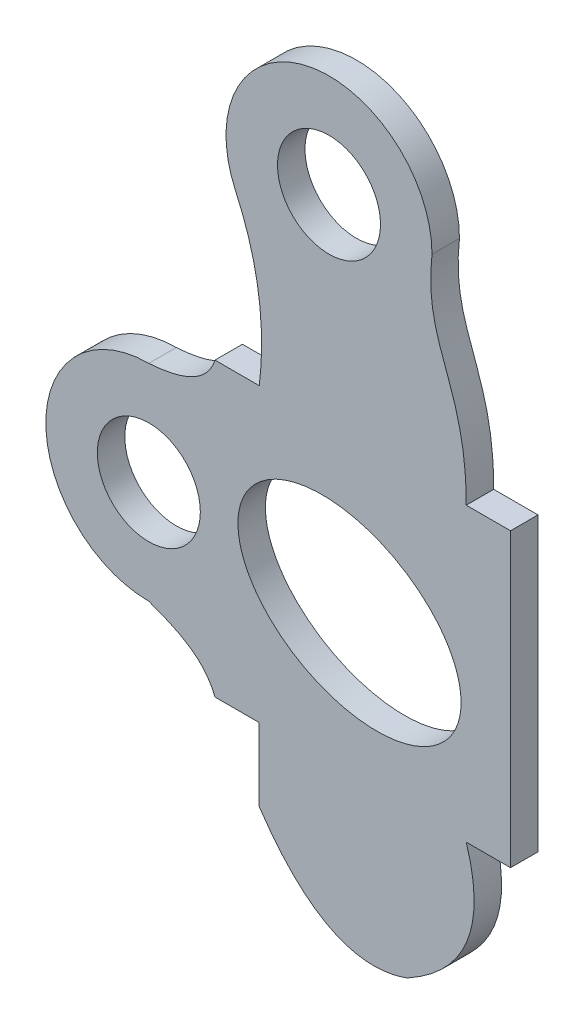
ISO-10303-21;
HEADER;
FILE_DESCRIPTION(('STEP AP214'),'2;1');
FILE_NAME('part.step','',(''),(''),'','','');
FILE_SCHEMA(('AUTOMOTIVE_DESIGN { 1 0 10303 214 1 1 1 1 }'));
ENDSEC;
DATA;
#1=APPLICATION_CONTEXT('core data for automotive mechanical design processes');
#2=APPLICATION_PROTOCOL_DEFINITION('international standard','automotive_design',2000,#1);
#3=PRODUCT_CONTEXT('',#1,'mechanical');
#4=PRODUCT('Part','Part','',(#3));
#5=PRODUCT_RELATED_PRODUCT_CATEGORY('part','',(#4));
#6=PRODUCT_DEFINITION_FORMATION('','',#4);
#7=PRODUCT_DEFINITION_CONTEXT('part definition',#1,'design');
#8=PRODUCT_DEFINITION('design','',#6,#7);
#9=PRODUCT_DEFINITION_SHAPE('','',#8);
#10=(LENGTH_UNIT() NAMED_UNIT(*) SI_UNIT(.MILLI.,.METRE.));
#11=(NAMED_UNIT(*) PLANE_ANGLE_UNIT() SI_UNIT($,.RADIAN.));
#12=(NAMED_UNIT(*) SI_UNIT($,.STERADIAN.) SOLID_ANGLE_UNIT());
#13=UNCERTAINTY_MEASURE_WITH_UNIT(LENGTH_MEASURE(1.E-05),#10,'distance_accuracy_value','');
#14=(GEOMETRIC_REPRESENTATION_CONTEXT(3) GLOBAL_UNCERTAINTY_ASSIGNED_CONTEXT((#13)) GLOBAL_UNIT_ASSIGNED_CONTEXT((#10,
#11,#12)) REPRESENTATION_CONTEXT('',''));
#15=CARTESIAN_POINT('',(0.,0.,0.));
#16=DIRECTION('',(0.,0.,1.));
#17=DIRECTION('',(1.,0.,0.));
#18=AXIS2_PLACEMENT_3D('',#15,#16,#17);
#19=CARTESIAN_POINT('',(6.,0.,1.6));
#20=CARTESIAN_POINT('',(5.45390542392349,-4.8146678348564,1.6));
#21=CARTESIAN_POINT('',(8.01032004438015,-5.6020208774235,1.6));
#22=CARTESIAN_POINT('',(7.9955341775791,-11.6645240386324,1.6));
#23=B_SPLINE_CURVE_WITH_KNOTS('',3,(#19,#20,#21,#22),.UNSPECIFIED.,.F.,.F.,(4,4),(0.,1.),.UNSPECIFIED.);
#24=DIRECTION('',(0.,0.,-1.));
#25=VECTOR('',#24,1.);
#26=SURFACE_OF_LINEAR_EXTRUSION('',#23,#25);
#27=CARTESIAN_POINT('',(6.,0.,0.));
#28=CARTESIAN_POINT('',(5.45390542392349,-4.8146678348564,0.));
#29=CARTESIAN_POINT('',(8.01032004438015,-5.6020208774235,0.));
#30=CARTESIAN_POINT('',(7.9955341775791,-11.6645240386324,0.));
#31=B_SPLINE_CURVE_WITH_KNOTS('',3,(#27,#28,#29,#30),.UNSPECIFIED.,.F.,.F.,(4,4),(0.,1.),.UNSPECIFIED.);
#32=CARTESIAN_POINT('',(5.99999999999995,0.,0.));
#33=VERTEX_POINT('',#32);
#34=CARTESIAN_POINT('',(7.9955341775791,-11.6645240386324,0.));
#35=VERTEX_POINT('',#34);
#36=EDGE_CURVE('E178',#33,#35,#31,.T.);
#37=ORIENTED_EDGE('',*,*,#36,.F.);
#38=DIRECTION('',(0.,0.,-1.));
#39=VECTOR('',#38,1.);
#40=CARTESIAN_POINT('',(5.99999999999995,0.,1.6));
#41=LINE('',#40,#39);
#42=CARTESIAN_POINT('',(5.99999999999995,0.,1.6));
#43=VERTEX_POINT('',#42);
#44=EDGE_CURVE('E11',#43,#33,#41,.T.);
#45=ORIENTED_EDGE('',*,*,#44,.F.);
#46=CARTESIAN_POINT('',(7.9955341775791,-11.6645240386324,1.6));
#47=VERTEX_POINT('',#46);
#48=EDGE_CURVE('E360',#43,#47,#23,.T.);
#49=ORIENTED_EDGE('',*,*,#48,.T.);
#50=DIRECTION('',(0.,0.,-1.));
#51=VECTOR('',#50,1.);
#52=CARTESIAN_POINT('',(7.9955341775791,-11.6645240386324,1.6));
#53=LINE('',#52,#51);
#54=EDGE_CURVE('E54',#47,#35,#53,.T.);
#55=ORIENTED_EDGE('',*,*,#54,.T.);
#56=EDGE_LOOP('',(#37,#45,#49,#55));
#57=FACE_BOUND('',#56,.T.);
#58=ADVANCED_FACE('F37',(#57),#26,.T.);
#59=CARTESIAN_POINT('',(0.,0.,1.6));
#60=DIRECTION('',(0.,0.,-1.));
#61=DIRECTION('',(-1.,0.,0.));
#62=AXIS2_PLACEMENT_3D('',#59,#60,#61);
#63=CYLINDRICAL_SURFACE('',#62,5.99999999999995);
#64=CARTESIAN_POINT('',(0.,0.,0.));
#65=DIRECTION('',(0.,0.,1.));
#66=DIRECTION('',(1.,0.,0.));
#67=AXIS2_PLACEMENT_3D('',#64,#65,#66);
#68=CIRCLE('',#67,5.99999999999995);
#69=CARTESIAN_POINT('',(-5.46891503399917,-2.46798872584485,0.));
#70=VERTEX_POINT('',#69);
#71=EDGE_CURVE('E288',#33,#70,#68,.T.);
#72=ORIENTED_EDGE('',*,*,#71,.T.);
#73=DIRECTION('',(0.,0.,-1.));
#74=VECTOR('',#73,1.);
#75=CARTESIAN_POINT('',(-5.46891503399917,-2.46798872584485,1.6));
#76=LINE('',#75,#74);
#77=CARTESIAN_POINT('',(-5.46891503399917,-2.46798872584485,1.6));
#78=VERTEX_POINT('',#77);
#79=EDGE_CURVE('E46',#78,#70,#76,.T.);
#80=ORIENTED_EDGE('',*,*,#79,.F.);
#81=CARTESIAN_POINT('',(0.,0.,1.6));
#82=DIRECTION('',(0.,0.,1.));
#83=DIRECTION('',(1.,0.,0.));
#84=AXIS2_PLACEMENT_3D('',#81,#82,#83);
#85=CIRCLE('',#84,5.99999999999995);
#86=EDGE_CURVE('E273',#43,#78,#85,.T.);
#87=ORIENTED_EDGE('',*,*,#86,.F.);
#88=ORIENTED_EDGE('',*,*,#44,.T.);
#89=EDGE_LOOP('',(#72,#80,#87,#88));
#90=FACE_BOUND('',#89,.T.);
#91=ADVANCED_FACE('F279',(#90),#63,.T.);
#92=CARTESIAN_POINT('',(-5.46891503399921,-2.46798872584487,1.6));
#93=CARTESIAN_POINT('',(-3.46503446090008,-6.80134887140103,1.6));
#94=CARTESIAN_POINT('',(-4.0644658224209,-11.6645240386324,1.6));
#95=B_SPLINE_CURVE_WITH_KNOTS('',2,(#92,#93,#94),.UNSPECIFIED.,.F.,.F.,(3,3),(0.,1.),.UNSPECIFIED.);
#96=DIRECTION('',(0.,0.,-1.));
#97=VECTOR('',#96,1.);
#98=SURFACE_OF_LINEAR_EXTRUSION('',#95,#97);
#99=CARTESIAN_POINT('',(-5.46891503399921,-2.46798872584487,0.));
#100=CARTESIAN_POINT('',(-3.46503446090008,-6.80134887140103,0.));
#101=CARTESIAN_POINT('',(-4.0644658224209,-11.6645240386324,0.));
#102=B_SPLINE_CURVE_WITH_KNOTS('',2,(#99,#100,#101),.UNSPECIFIED.,.F.,.F.,(3,3),(0.,1.),.UNSPECIFIED.);
#103=CARTESIAN_POINT('',(-4.0644658224209,-11.6645240386324,0.));
#104=VERTEX_POINT('',#103);
#105=EDGE_CURVE('E293',#70,#104,#102,.T.);
#106=ORIENTED_EDGE('',*,*,#105,.T.);
#107=DIRECTION('',(0.,0.,-1.));
#108=VECTOR('',#107,1.);
#109=CARTESIAN_POINT('',(-4.0644658224209,-11.6645240386324,1.6));
#110=LINE('',#109,#108);
#111=CARTESIAN_POINT('',(-4.0644658224209,-11.6645240386324,1.6));
#112=VERTEX_POINT('',#111);
#113=EDGE_CURVE('E297',#112,#104,#110,.T.);
#114=ORIENTED_EDGE('',*,*,#113,.F.);
#115=EDGE_CURVE('E268',#78,#112,#95,.T.);
#116=ORIENTED_EDGE('',*,*,#115,.F.);
#117=ORIENTED_EDGE('',*,*,#79,.T.);
#118=EDGE_LOOP('',(#106,#114,#116,#117));
#119=FACE_BOUND('',#118,.T.);
#120=ADVANCED_FACE('F277',(#119),#98,.F.);
#121=CARTESIAN_POINT('',(0.,-11.6645240386324,1.6));
#122=DIRECTION('',(0.,1.,0.));
#123=DIRECTION('',(0.,0.,1.));
#124=AXIS2_PLACEMENT_3D('',#121,#122,#123);
#125=PLANE('',#124);
#126=DIRECTION('',(1.,0.,0.));
#127=VECTOR('',#126,1.);
#128=CARTESIAN_POINT('',(0.,-11.6645240386324,0.));
#129=LINE('',#128,#127);
#130=CARTESIAN_POINT('',(-6.6444658224209,-11.6645240386324,0.));
#131=VERTEX_POINT('',#130);
#132=EDGE_CURVE('E301',#131,#104,#129,.T.);
#133=ORIENTED_EDGE('',*,*,#132,.F.);
#134=DIRECTION('',(0.,0.,-1.));
#135=VECTOR('',#134,1.);
#136=CARTESIAN_POINT('',(-6.6444658224209,-11.6645240386324,1.6));
#137=LINE('',#136,#135);
#138=CARTESIAN_POINT('',(-6.6444658224209,-11.6645240386324,1.6));
#139=VERTEX_POINT('',#138);
#140=EDGE_CURVE('E382',#139,#131,#137,.T.);
#141=ORIENTED_EDGE('',*,*,#140,.F.);
#142=DIRECTION('',(1.,0.,0.));
#143=VECTOR('',#142,1.);
#144=CARTESIAN_POINT('',(0.,-11.6645240386324,1.6));
#145=LINE('',#144,#143);
#146=EDGE_CURVE('E262',#139,#112,#145,.T.);
#147=ORIENTED_EDGE('',*,*,#146,.T.);
#148=ORIENTED_EDGE('',*,*,#113,.T.);
#149=EDGE_LOOP('',(#133,#141,#147,#148));
#150=FACE_BOUND('',#149,.T.);
#151=ADVANCED_FACE('F254',(#150),#125,.T.);
#152=CARTESIAN_POINT('',(-6.6444658224209,-11.6645240386324,1.6));
#153=CARTESIAN_POINT('',(-7.21761986573423,-13.544357503307,1.6));
#154=CARTESIAN_POINT('',(-10.4964106491428,-13.7566083023555,1.6));
#155=B_SPLINE_CURVE_WITH_KNOTS('',2,(#152,#153,#154),.UNSPECIFIED.,.F.,.F.,(3,3),(0.,1.),.UNSPECIFIED.);
#156=DIRECTION('',(0.,0.,-1.));
#157=VECTOR('',#156,1.);
#158=SURFACE_OF_LINEAR_EXTRUSION('',#155,#157);
#159=CARTESIAN_POINT('',(-6.6444658224209,-11.6645240386324,0.));
#160=CARTESIAN_POINT('',(-7.21761986573423,-13.544357503307,0.));
#161=CARTESIAN_POINT('',(-10.4964106491428,-13.7566083023555,0.));
#162=B_SPLINE_CURVE_WITH_KNOTS('',2,(#159,#160,#161),.UNSPECIFIED.,.F.,.F.,(3,3),(0.,1.),.UNSPECIFIED.);
#163=CARTESIAN_POINT('',(-10.4964106491428,-13.7566083023555,0.));
#164=VERTEX_POINT('',#163);
#165=EDGE_CURVE('E303',#131,#164,#162,.T.);
#166=ORIENTED_EDGE('',*,*,#165,.T.);
#167=DIRECTION('',(0.,0.,-1.));
#168=VECTOR('',#167,1.);
#169=CARTESIAN_POINT('',(-10.4964106491428,-13.7566083023555,1.6));
#170=LINE('',#169,#168);
#171=CARTESIAN_POINT('',(-10.4964106491428,-13.7566083023555,1.6));
#172=VERTEX_POINT('',#171);
#173=EDGE_CURVE('E379',#172,#164,#170,.T.);
#174=ORIENTED_EDGE('',*,*,#173,.F.);
#175=EDGE_CURVE('E257',#139,#172,#155,.T.);
#176=ORIENTED_EDGE('',*,*,#175,.F.);
#177=ORIENTED_EDGE('',*,*,#140,.T.);
#178=EDGE_LOOP('',(#166,#174,#176,#177));
#179=FACE_BOUND('',#178,.T.);
#180=ADVANCED_FACE('F250',(#179),#158,.F.);
#181=CARTESIAN_POINT('',(-10.4964106491428,-19.7566083023555,1.6));
#182=DIRECTION('',(0.,0.,-1.));
#183=DIRECTION('',(-1.,0.,0.));
#184=AXIS2_PLACEMENT_3D('',#181,#182,#183);
#185=CYLINDRICAL_SURFACE('',#184,6.);
#186=CARTESIAN_POINT('',(-10.4964106491428,-19.7566083023555,0.));
#187=DIRECTION('',(0.,0.,1.));
#188=DIRECTION('',(1.,0.,0.));
#189=AXIS2_PLACEMENT_3D('',#186,#187,#188);
#190=CIRCLE('',#189,6.);
#191=CARTESIAN_POINT('',(-10.4964106491428,-25.7566083023555,0.));
#192=VERTEX_POINT('',#191);
#193=EDGE_CURVE('E314',#164,#192,#190,.T.);
#194=ORIENTED_EDGE('',*,*,#193,.T.);
#195=DIRECTION('',(0.,0.,-1.));
#196=VECTOR('',#195,1.);
#197=CARTESIAN_POINT('',(-10.4964106491428,-25.7566083023555,1.6));
#198=LINE('',#197,#196);
#199=CARTESIAN_POINT('',(-10.4964106491428,-25.7566083023555,1.6));
#200=VERTEX_POINT('',#199);
#201=EDGE_CURVE('E376',#200,#192,#198,.T.);
#202=ORIENTED_EDGE('',*,*,#201,.F.);
#203=CARTESIAN_POINT('',(-10.4964106491428,-19.7566083023555,1.6));
#204=DIRECTION('',(0.,0.,1.));
#205=DIRECTION('',(1.,0.,0.));
#206=AXIS2_PLACEMENT_3D('',#203,#204,#205);
#207=CIRCLE('',#206,6.);
#208=EDGE_CURVE('E235',#172,#200,#207,.T.);
#209=ORIENTED_EDGE('',*,*,#208,.F.);
#210=ORIENTED_EDGE('',*,*,#173,.T.);
#211=EDGE_LOOP('',(#194,#202,#209,#210));
#212=FACE_BOUND('',#211,.T.);
#213=ADVANCED_FACE('F246',(#212),#185,.T.);
#214=CARTESIAN_POINT('',(-10.4964106491428,-25.7566083023555,1.6));
#215=CARTESIAN_POINT('',(-8.76971482484553,-26.3939791661416,1.6));
#216=CARTESIAN_POINT('',(-7.26892822895749,-27.0535783594169,1.6));
#217=CARTESIAN_POINT('',(-6.6444658224209,-28.6645240386324,1.6));
#218=B_SPLINE_CURVE_WITH_KNOTS('',3,(#214,#215,#216,#217),.UNSPECIFIED.,.F.,.F.,(4,4),(0.,1.),.UNSPECIFIED.);
#219=DIRECTION('',(0.,0.,-1.));
#220=VECTOR('',#219,1.);
#221=SURFACE_OF_LINEAR_EXTRUSION('',#218,#220);
#222=CARTESIAN_POINT('',(-10.4964106491428,-25.7566083023555,0.));
#223=CARTESIAN_POINT('',(-8.76971482484553,-26.3939791661416,0.));
#224=CARTESIAN_POINT('',(-7.26892822895749,-27.0535783594169,0.));
#225=CARTESIAN_POINT('',(-6.6444658224209,-28.6645240386324,0.));
#226=B_SPLINE_CURVE_WITH_KNOTS('',3,(#222,#223,#224,#225),.UNSPECIFIED.,.F.,.F.,(4,4),(0.,1.),.UNSPECIFIED.);
#227=CARTESIAN_POINT('',(-6.6444658224209,-28.6645240386324,0.));
#228=VERTEX_POINT('',#227);
#229=EDGE_CURVE('E319',#192,#228,#226,.T.);
#230=ORIENTED_EDGE('',*,*,#229,.T.);
#231=DIRECTION('',(0.,0.,-1.));
#232=VECTOR('',#231,1.);
#233=CARTESIAN_POINT('',(-6.6444658224209,-28.6645240386324,1.6));
#234=LINE('',#233,#232);
#235=CARTESIAN_POINT('',(-6.6444658224209,-28.6645240386324,1.6));
#236=VERTEX_POINT('',#235);
#237=EDGE_CURVE('E373',#236,#228,#234,.T.);
#238=ORIENTED_EDGE('',*,*,#237,.F.);
#239=EDGE_CURVE('E230',#200,#236,#218,.T.);
#240=ORIENTED_EDGE('',*,*,#239,.F.);
#241=ORIENTED_EDGE('',*,*,#201,.T.);
#242=EDGE_LOOP('',(#230,#238,#240,#241));
#243=FACE_BOUND('',#242,.T.);
#244=ADVANCED_FACE('F241',(#243),#221,.F.);
#245=CARTESIAN_POINT('',(0.,-28.6645240386324,1.6));
#246=DIRECTION('',(0.,1.,0.));
#247=DIRECTION('',(0.,0.,1.));
#248=AXIS2_PLACEMENT_3D('',#245,#246,#247);
#249=PLANE('',#248);
#250=DIRECTION('',(1.,0.,0.));
#251=VECTOR('',#250,1.);
#252=CARTESIAN_POINT('',(0.,-28.6645240386324,0.));
#253=LINE('',#252,#251);
#254=CARTESIAN_POINT('',(-4.0644658224209,-28.6645240386324,0.));
#255=VERTEX_POINT('',#254);
#256=EDGE_CURVE('E323',#228,#255,#253,.T.);
#257=ORIENTED_EDGE('',*,*,#256,.T.);
#258=DIRECTION('',(0.,0.,-1.));
#259=VECTOR('',#258,1.);
#260=CARTESIAN_POINT('',(-4.0644658224209,-28.6645240386324,1.6));
#261=LINE('',#260,#259);
#262=CARTESIAN_POINT('',(-4.0644658224209,-28.6645240386324,1.6));
#263=VERTEX_POINT('',#262);
#264=EDGE_CURVE('E370',#263,#255,#261,.T.);
#265=ORIENTED_EDGE('',*,*,#264,.F.);
#266=DIRECTION('',(1.,0.,0.));
#267=VECTOR('',#266,1.);
#268=CARTESIAN_POINT('',(0.,-28.6645240386324,1.6));
#269=LINE('',#268,#267);
#270=EDGE_CURVE('E228',#236,#263,#269,.T.);
#271=ORIENTED_EDGE('',*,*,#270,.F.);
#272=ORIENTED_EDGE('',*,*,#237,.T.);
#273=EDGE_LOOP('',(#257,#265,#271,#272));
#274=FACE_BOUND('',#273,.T.);
#275=ADVANCED_FACE('F245',(#274),#249,.F.);
#276=CARTESIAN_POINT('',(-4.0644658224209,0.,1.6));
#277=DIRECTION('',(1.,0.,0.));
#278=DIRECTION('',(0.,0.,-1.));
#279=AXIS2_PLACEMENT_3D('',#276,#277,#278);
#280=PLANE('',#279);
#281=DIRECTION('',(0.,-1.,0.));
#282=VECTOR('',#281,1.);
#283=CARTESIAN_POINT('',(-4.0644658224209,0.,0.));
#284=LINE('',#283,#282);
#285=CARTESIAN_POINT('',(-4.0644658224209,-32.9044245519479,0.));
#286=VERTEX_POINT('',#285);
#287=EDGE_CURVE('E328',#255,#286,#284,.T.);
#288=ORIENTED_EDGE('',*,*,#287,.T.);
#289=DIRECTION('',(0.,0.,-1.));
#290=VECTOR('',#289,1.);
#291=CARTESIAN_POINT('',(-4.0644658224209,-32.9044245519479,1.6));
#292=LINE('',#291,#290);
#293=CARTESIAN_POINT('',(-4.0644658224209,-32.9044245519479,1.6));
#294=VERTEX_POINT('',#293);
#295=EDGE_CURVE('E367',#294,#286,#292,.T.);
#296=ORIENTED_EDGE('',*,*,#295,.F.);
#297=DIRECTION('',(0.,-1.,0.));
#298=VECTOR('',#297,1.);
#299=CARTESIAN_POINT('',(-4.0644658224209,0.,1.6));
#300=LINE('',#299,#298);
#301=EDGE_CURVE('E223',#263,#294,#300,.T.);
#302=ORIENTED_EDGE('',*,*,#301,.F.);
#303=ORIENTED_EDGE('',*,*,#264,.T.);
#304=EDGE_LOOP('',(#288,#296,#302,#303));
#305=FACE_BOUND('',#304,.T.);
#306=ADVANCED_FACE('F403',(#305),#280,.F.);
#307=CARTESIAN_POINT('',(-4.0644658224209,-32.9044245519479,1.6));
#308=CARTESIAN_POINT('',(-1.36551093767384,-36.9178003251028,1.6));
#309=CARTESIAN_POINT('',(1.53629435429236,-38.3433586049444,1.6));
#310=CARTESIAN_POINT('',(4.55683599621199,-37.2380939644521,1.6));
#311=B_SPLINE_CURVE_WITH_KNOTS('',3,(#307,#308,#309,#310),.UNSPECIFIED.,.F.,.F.,(4,4),(0.,1.),.UNSPECIFIED.);
#312=DIRECTION('',(0.,0.,-1.));
#313=VECTOR('',#312,1.);
#314=SURFACE_OF_LINEAR_EXTRUSION('',#311,#313);
#315=CARTESIAN_POINT('',(-4.0644658224209,-32.9044245519479,0.));
#316=CARTESIAN_POINT('',(-1.36551093767384,-36.9178003251028,0.));
#317=CARTESIAN_POINT('',(1.53629435429236,-38.3433586049444,0.));
#318=CARTESIAN_POINT('',(4.55683599621199,-37.2380939644521,0.));
#319=B_SPLINE_CURVE_WITH_KNOTS('',3,(#315,#316,#317,#318),.UNSPECIFIED.,.F.,.F.,(4,4),(0.,1.),.UNSPECIFIED.);
#320=CARTESIAN_POINT('',(4.55683599621199,-37.2380939644521,0.));
#321=VERTEX_POINT('',#320);
#322=EDGE_CURVE('E330',#286,#321,#319,.T.);
#323=ORIENTED_EDGE('',*,*,#322,.T.);
#324=DIRECTION('',(0.,0.,-1.));
#325=VECTOR('',#324,1.);
#326=CARTESIAN_POINT('',(4.55683599621199,-37.2380939644521,1.6));
#327=LINE('',#326,#325);
#328=CARTESIAN_POINT('',(4.55683599621199,-37.2380939644521,1.6));
#329=VERTEX_POINT('',#328);
#330=EDGE_CURVE('E364',#329,#321,#327,.T.);
#331=ORIENTED_EDGE('',*,*,#330,.F.);
#332=EDGE_CURVE('E215',#294,#329,#311,.T.);
#333=ORIENTED_EDGE('',*,*,#332,.F.);
#334=ORIENTED_EDGE('',*,*,#295,.T.);
#335=EDGE_LOOP('',(#323,#331,#333,#334));
#336=FACE_BOUND('',#335,.T.);
#337=ADVANCED_FACE('F208',(#336),#314,.F.);
#338=CARTESIAN_POINT('',(4.55683599621199,-37.2380939644521,1.6));
#339=CARTESIAN_POINT('',(7.35348909068773,-35.6946578515372,1.6));
#340=CARTESIAN_POINT('',(9.41088737003492,-33.1466917893871,1.6));
#341=CARTESIAN_POINT('',(7.9955341775791,-28.6645240386324,1.6));
#342=B_SPLINE_CURVE_WITH_KNOTS('',3,(#338,#339,#340,#341),.UNSPECIFIED.,.F.,.F.,(4,4),(0.,1.),.UNSPECIFIED.);
#343=DIRECTION('',(0.,0.,-1.));
#344=VECTOR('',#343,1.);
#345=SURFACE_OF_LINEAR_EXTRUSION('',#342,#344);
#346=CARTESIAN_POINT('',(4.55683599621199,-37.2380939644521,0.));
#347=CARTESIAN_POINT('',(7.35348909068773,-35.6946578515372,0.));
#348=CARTESIAN_POINT('',(9.41088737003492,-33.1466917893871,0.));
#349=CARTESIAN_POINT('',(7.9955341775791,-28.6645240386324,0.));
#350=B_SPLINE_CURVE_WITH_KNOTS('',3,(#346,#347,#348,#349),.UNSPECIFIED.,.F.,.F.,(4,4),(0.,1.),.UNSPECIFIED.);
#351=CARTESIAN_POINT('',(7.9955341775791,-28.6645240386324,0.));
#352=VERTEX_POINT('',#351);
#353=EDGE_CURVE('E334',#321,#352,#350,.T.);
#354=ORIENTED_EDGE('',*,*,#353,.T.);
#355=DIRECTION('',(0.,0.,-1.));
#356=VECTOR('',#355,1.);
#357=CARTESIAN_POINT('',(7.9955341775791,-28.6645240386324,1.6));
#358=LINE('',#357,#356);
#359=CARTESIAN_POINT('',(7.9955341775791,-28.6645240386324,1.6));
#360=VERTEX_POINT('',#359);
#361=EDGE_CURVE('E149',#360,#352,#358,.T.);
#362=ORIENTED_EDGE('',*,*,#361,.F.);
#363=EDGE_CURVE('E159',#329,#360,#342,.T.);
#364=ORIENTED_EDGE('',*,*,#363,.F.);
#365=ORIENTED_EDGE('',*,*,#330,.T.);
#366=EDGE_LOOP('',(#354,#362,#364,#365));
#367=FACE_BOUND('',#366,.T.);
#368=ADVANCED_FACE('F205',(#367),#345,.F.);
#369=CARTESIAN_POINT('',(0.,-28.6645240386324,1.6));
#370=DIRECTION('',(0.,-1.,0.));
#371=DIRECTION('',(0.,0.,-1.));
#372=AXIS2_PLACEMENT_3D('',#369,#370,#371);
#373=PLANE('',#372);
#374=DIRECTION('',(-1.,0.,0.));
#375=VECTOR('',#374,1.);
#376=CARTESIAN_POINT('',(0.,-28.6645240386324,0.));
#377=LINE('',#376,#375);
#378=CARTESIAN_POINT('',(10.5755341775791,-28.6645240386324,0.));
#379=VERTEX_POINT('',#378);
#380=EDGE_CURVE('E145',#379,#352,#377,.T.);
#381=ORIENTED_EDGE('',*,*,#380,.F.);
#382=DIRECTION('',(0.,0.,-1.));
#383=VECTOR('',#382,1.);
#384=CARTESIAN_POINT('',(10.5755341775791,-28.6645240386324,1.6));
#385=LINE('',#384,#383);
#386=CARTESIAN_POINT('',(10.5755341775791,-28.6645240386324,1.6));
#387=VERTEX_POINT('',#386);
#388=EDGE_CURVE('E140',#387,#379,#385,.T.);
#389=ORIENTED_EDGE('',*,*,#388,.F.);
#390=DIRECTION('',(-1.,0.,0.));
#391=VECTOR('',#390,1.);
#392=CARTESIAN_POINT('',(0.,-28.6645240386324,1.6));
#393=LINE('',#392,#391);
#394=EDGE_CURVE('E143',#387,#360,#393,.T.);
#395=ORIENTED_EDGE('',*,*,#394,.T.);
#396=ORIENTED_EDGE('',*,*,#361,.T.);
#397=EDGE_LOOP('',(#381,#389,#395,#396));
#398=FACE_BOUND('',#397,.T.);
#399=ADVANCED_FACE('F142',(#398),#373,.T.);
#400=CARTESIAN_POINT('',(10.5755341775791,0.,1.6));
#401=DIRECTION('',(1.,0.,0.));
#402=DIRECTION('',(0.,0.,-1.));
#403=AXIS2_PLACEMENT_3D('',#400,#401,#402);
#404=PLANE('',#403);
#405=DIRECTION('',(0.,-1.,0.));
#406=VECTOR('',#405,1.);
#407=CARTESIAN_POINT('',(10.5755341775791,0.,0.));
#408=LINE('',#407,#406);
#409=CARTESIAN_POINT('',(10.5755341775791,-11.6645240386324,0.));
#410=VERTEX_POINT('',#409);
#411=EDGE_CURVE('E346',#410,#379,#408,.T.);
#412=ORIENTED_EDGE('',*,*,#411,.F.);
#413=DIRECTION('',(0.,0.,-1.));
#414=VECTOR('',#413,1.);
#415=CARTESIAN_POINT('',(10.5755341775791,-11.6645240386324,1.6));
#416=LINE('',#415,#414);
#417=CARTESIAN_POINT('',(10.5755341775791,-11.6645240386324,1.6));
#418=VERTEX_POINT('',#417);
#419=EDGE_CURVE('E97',#418,#410,#416,.T.);
#420=ORIENTED_EDGE('',*,*,#419,.F.);
#421=DIRECTION('',(0.,-1.,0.));
#422=VECTOR('',#421,1.);
#423=CARTESIAN_POINT('',(10.5755341775791,0.,1.6));
#424=LINE('',#423,#422);
#425=EDGE_CURVE('E157',#418,#387,#424,.T.);
#426=ORIENTED_EDGE('',*,*,#425,.T.);
#427=ORIENTED_EDGE('',*,*,#388,.T.);
#428=EDGE_LOOP('',(#412,#420,#426,#427));
#429=FACE_BOUND('',#428,.T.);
#430=ADVANCED_FACE('F162',(#429),#404,.T.);
#431=CARTESIAN_POINT('',(-10.4964106491428,-19.7566083023555,1.6));
#432=DIRECTION('',(0.,0.,-1.));
#433=DIRECTION('',(-1.,0.,0.));
#434=AXIS2_PLACEMENT_3D('',#431,#432,#433);
#435=CYLINDRICAL_SURFACE('',#434,3.);
#436=CARTESIAN_POINT('',(-10.4964106491428,-19.7566083023555,1.6));
#437=DIRECTION('',(0.,0.,1.));
#438=DIRECTION('',(1.,0.,0.));
#439=AXIS2_PLACEMENT_3D('',#436,#437,#438);
#440=CIRCLE('',#439,3.);
#441=CARTESIAN_POINT('',(-7.49641064914281,-19.7566083023555,1.6));
#442=VERTEX_POINT('',#441);
#443=EDGE_CURVE('E171',#442,#442,#440,.T.);
#444=ORIENTED_EDGE('',*,*,#443,.T.);
#445=EDGE_LOOP('',(#444));
#446=FACE_BOUND('',#445,.T.);
#447=CARTESIAN_POINT('',(-10.4964106491428,-19.7566083023555,0.));
#448=DIRECTION('',(0.,0.,1.));
#449=DIRECTION('',(1.,0.,0.));
#450=AXIS2_PLACEMENT_3D('',#447,#448,#449);
#451=CIRCLE('',#450,3.);
#452=CARTESIAN_POINT('',(-7.49641064914281,-19.7566083023555,0.));
#453=VERTEX_POINT('',#452);
#454=EDGE_CURVE('E354',#453,#453,#451,.T.);
#455=ORIENTED_EDGE('',*,*,#454,.F.);
#456=EDGE_LOOP('',(#455));
#457=FACE_BOUND('',#456,.T.);
#458=ADVANCED_FACE('F191',(#446,#457),#435,.F.);
#459=CARTESIAN_POINT('',(0.,0.,1.6));
#460=DIRECTION('',(0.,0.,-1.));
#461=DIRECTION('',(-1.,0.,0.));
#462=AXIS2_PLACEMENT_3D('',#459,#460,#461);
#463=CYLINDRICAL_SURFACE('',#462,3.);
#464=CARTESIAN_POINT('',(0.,0.,1.6));
#465=DIRECTION('',(0.,0.,1.));
#466=DIRECTION('',(1.,0.,0.));
#467=AXIS2_PLACEMENT_3D('',#464,#465,#466);
#468=CIRCLE('',#467,3.);
#469=CARTESIAN_POINT('',(3.,0.,1.6));
#470=VERTEX_POINT('',#469);
#471=EDGE_CURVE('E165',#470,#470,#468,.T.);
#472=ORIENTED_EDGE('',*,*,#471,.T.);
#473=EDGE_LOOP('',(#472));
#474=FACE_BOUND('',#473,.T.);
#475=CARTESIAN_POINT('',(0.,0.,0.));
#476=DIRECTION('',(0.,0.,1.));
#477=DIRECTION('',(1.,0.,0.));
#478=AXIS2_PLACEMENT_3D('',#475,#476,#477);
#479=CIRCLE('',#478,3.);
#480=CARTESIAN_POINT('',(3.,0.,0.));
#481=VERTEX_POINT('',#480);
#482=EDGE_CURVE('E351',#481,#481,#479,.T.);
#483=ORIENTED_EDGE('',*,*,#482,.F.);
#484=EDGE_LOOP('',(#483));
#485=FACE_BOUND('',#484,.T.);
#486=ADVANCED_FACE('F194',(#474,#485),#463,.F.);
#487=CARTESIAN_POINT('',(0.,-11.6645240386324,1.6));
#488=DIRECTION('',(0.,1.,0.));
#489=DIRECTION('',(0.,0.,1.));
#490=AXIS2_PLACEMENT_3D('',#487,#488,#489);
#491=PLANE('',#490);
#492=DIRECTION('',(1.,0.,0.));
#493=VECTOR('',#492,1.);
#494=CARTESIAN_POINT('',(0.,-11.6645240386324,0.));
#495=LINE('',#494,#493);
#496=EDGE_CURVE('E348',#35,#410,#495,.T.);
#497=ORIENTED_EDGE('',*,*,#496,.F.);
#498=ORIENTED_EDGE('',*,*,#54,.F.);
#499=DIRECTION('',(1.,0.,0.));
#500=VECTOR('',#499,1.);
#501=CARTESIAN_POINT('',(0.,-11.6645240386324,1.6));
#502=LINE('',#501,#500);
#503=EDGE_CURVE('E163',#47,#418,#502,.T.);
#504=ORIENTED_EDGE('',*,*,#503,.T.);
#505=ORIENTED_EDGE('',*,*,#419,.T.);
#506=EDGE_LOOP('',(#497,#498,#504,#505));
#507=FACE_BOUND('',#506,.T.);
#508=ADVANCED_FACE('F187',(#507),#491,.T.);
#509=CARTESIAN_POINT('',(1.19450627961386,-20.5011638196081,1.6));
#510=DIRECTION('',(0.,0.,1.));
#511=DIRECTION('',(-0.917683154182089,0.39731301077414,0.));
#512=AXIS2_PLACEMENT_3D('',#509,#510,#511);
#513=ELLIPSE('',#512,6.77013765050752,4.81057531784366);
#514=DIRECTION('',(0.,0.,-1.));
#515=VECTOR('',#514,1.);
#516=SURFACE_OF_LINEAR_EXTRUSION('',#513,#515);
#517=CARTESIAN_POINT('',(-5.0183349937508,-17.8113000463296,1.6));
#518=VERTEX_POINT('',#517);
#519=EDGE_CURVE('E174',#518,#518,#513,.T.);
#520=ORIENTED_EDGE('',*,*,#519,.T.);
#521=EDGE_LOOP('',(#520));
#522=FACE_BOUND('',#521,.T.);
#523=CARTESIAN_POINT('',(1.19450627961386,-20.5011638196081,0.));
#524=DIRECTION('',(0.,0.,1.));
#525=DIRECTION('',(-0.917683154182089,0.39731301077414,0.));
#526=AXIS2_PLACEMENT_3D('',#523,#524,#525);
#527=ELLIPSE('',#526,6.77013765050752,4.81057531784366);
#528=CARTESIAN_POINT('',(-5.0183349937508,-17.8113000463296,0.));
#529=VERTEX_POINT('',#528);
#530=EDGE_CURVE('E357',#529,#529,#527,.T.);
#531=ORIENTED_EDGE('',*,*,#530,.F.);
#532=EDGE_LOOP('',(#531));
#533=FACE_BOUND('',#532,.T.);
#534=ADVANCED_FACE('F183',(#522,#533),#516,.T.);
#535=CARTESIAN_POINT('',(0.,0.,1.6));
#536=DIRECTION('',(0.,0.,1.));
#537=DIRECTION('',(1.,0.,0.));
#538=AXIS2_PLACEMENT_3D('',#535,#536,#537);
#539=PLANE('',#538);
#540=ORIENTED_EDGE('',*,*,#48,.F.);
#541=ORIENTED_EDGE('',*,*,#86,.T.);
#542=ORIENTED_EDGE('',*,*,#115,.T.);
#543=ORIENTED_EDGE('',*,*,#146,.F.);
#544=ORIENTED_EDGE('',*,*,#175,.T.);
#545=ORIENTED_EDGE('',*,*,#208,.T.);
#546=ORIENTED_EDGE('',*,*,#239,.T.);
#547=ORIENTED_EDGE('',*,*,#270,.T.);
#548=ORIENTED_EDGE('',*,*,#301,.T.);
#549=ORIENTED_EDGE('',*,*,#332,.T.);
#550=ORIENTED_EDGE('',*,*,#363,.T.);
#551=ORIENTED_EDGE('',*,*,#394,.F.);
#552=ORIENTED_EDGE('',*,*,#425,.F.);
#553=ORIENTED_EDGE('',*,*,#503,.F.);
#554=EDGE_LOOP('',(#540,#541,#542,#543,#544,#545,#546,#547,#548,#549,#550,#551,#552,#553));
#555=FACE_BOUND('',#554,.T.);
#556=ORIENTED_EDGE('',*,*,#471,.F.);
#557=EDGE_LOOP('',(#556));
#558=FACE_BOUND('',#557,.T.);
#559=ORIENTED_EDGE('',*,*,#443,.F.);
#560=EDGE_LOOP('',(#559));
#561=FACE_BOUND('',#560,.T.);
#562=ORIENTED_EDGE('',*,*,#519,.F.);
#563=EDGE_LOOP('',(#562));
#564=FACE_BOUND('',#563,.T.);
#565=ADVANCED_FACE('F154',(#555,#558,#561,#564),#539,.T.);
#566=CARTESIAN_POINT('',(0.,0.,0.));
#567=DIRECTION('',(0.,0.,1.));
#568=DIRECTION('',(1.,0.,0.));
#569=AXIS2_PLACEMENT_3D('',#566,#567,#568);
#570=PLANE('',#569);
#571=ORIENTED_EDGE('',*,*,#36,.T.);
#572=ORIENTED_EDGE('',*,*,#496,.T.);
#573=ORIENTED_EDGE('',*,*,#411,.T.);
#574=ORIENTED_EDGE('',*,*,#380,.T.);
#575=ORIENTED_EDGE('',*,*,#353,.F.);
#576=ORIENTED_EDGE('',*,*,#322,.F.);
#577=ORIENTED_EDGE('',*,*,#287,.F.);
#578=ORIENTED_EDGE('',*,*,#256,.F.);
#579=ORIENTED_EDGE('',*,*,#229,.F.);
#580=ORIENTED_EDGE('',*,*,#193,.F.);
#581=ORIENTED_EDGE('',*,*,#165,.F.);
#582=ORIENTED_EDGE('',*,*,#132,.T.);
#583=ORIENTED_EDGE('',*,*,#105,.F.);
#584=ORIENTED_EDGE('',*,*,#71,.F.);
#585=EDGE_LOOP('',(#571,#572,#573,#574,#575,#576,#577,#578,#579,#580,#581,#582,#583,#584));
#586=FACE_BOUND('',#585,.T.);
#587=ORIENTED_EDGE('',*,*,#482,.T.);
#588=EDGE_LOOP('',(#587));
#589=FACE_BOUND('',#588,.T.);
#590=ORIENTED_EDGE('',*,*,#454,.T.);
#591=EDGE_LOOP('',(#590));
#592=FACE_BOUND('',#591,.T.);
#593=ORIENTED_EDGE('',*,*,#530,.T.);
#594=EDGE_LOOP('',(#593));
#595=FACE_BOUND('',#594,.T.);
#596=ADVANCED_FACE('F189',(#586,#589,#592,#595),#570,.F.);
#597=CLOSED_SHELL('',(#58,#91,#120,#151,#180,#213,#244,#275,#306,#337,#368,#399,#430,#458,#486,
#508,#534,#565,#596));
#598=MANIFOLD_SOLID_BREP('B2',#597);
#599=ADVANCED_BREP_SHAPE_REPRESENTATION('',(#18,#598),#14);
#600=SHAPE_DEFINITION_REPRESENTATION(#9,#599);
ENDSEC;
END-ISO-10303-21;
